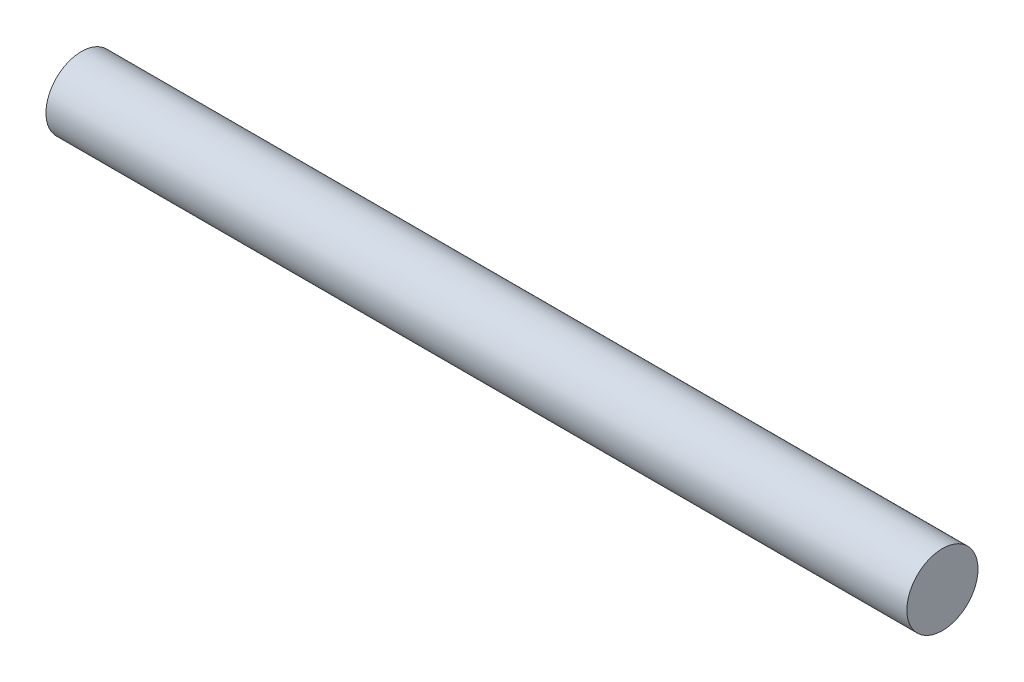
ISO-10303-21;
HEADER;
FILE_DESCRIPTION(('STEP AP214'),'2;1');
FILE_NAME('part.step','',(''),(''),'','','');
FILE_SCHEMA(('AUTOMOTIVE_DESIGN { 1 0 10303 214 1 1 1 1 }'));
ENDSEC;
DATA;
#1=APPLICATION_CONTEXT('core data for automotive mechanical design processes');
#2=APPLICATION_PROTOCOL_DEFINITION('international standard','automotive_design',2000,#1);
#3=PRODUCT_CONTEXT('',#1,'mechanical');
#4=PRODUCT('Part','Part','',(#3));
#5=PRODUCT_RELATED_PRODUCT_CATEGORY('part','',(#4));
#6=PRODUCT_DEFINITION_FORMATION('','',#4);
#7=PRODUCT_DEFINITION_CONTEXT('part definition',#1,'design');
#8=PRODUCT_DEFINITION('design','',#6,#7);
#9=PRODUCT_DEFINITION_SHAPE('','',#8);
#10=(LENGTH_UNIT() NAMED_UNIT(*) SI_UNIT(.MILLI.,.METRE.));
#11=(NAMED_UNIT(*) PLANE_ANGLE_UNIT() SI_UNIT($,.RADIAN.));
#12=(NAMED_UNIT(*) SI_UNIT($,.STERADIAN.) SOLID_ANGLE_UNIT());
#13=UNCERTAINTY_MEASURE_WITH_UNIT(LENGTH_MEASURE(1.E-05),#10,'distance_accuracy_value','');
#14=(GEOMETRIC_REPRESENTATION_CONTEXT(3) GLOBAL_UNCERTAINTY_ASSIGNED_CONTEXT((#13)) GLOBAL_UNIT_ASSIGNED_CONTEXT((#10,
#11,#12)) REPRESENTATION_CONTEXT('',''));
#15=CARTESIAN_POINT('',(0.,0.,0.));
#16=DIRECTION('',(0.,0.,1.));
#17=DIRECTION('',(1.,0.,0.));
#18=AXIS2_PLACEMENT_3D('',#15,#16,#17);
#19=CARTESIAN_POINT('',(72.63,0.,0.));
#20=DIRECTION('',(-1.,0.,0.));
#21=DIRECTION('',(0.,0.,1.));
#22=AXIS2_PLACEMENT_3D('',#19,#20,#21);
#23=CYLINDRICAL_SURFACE('',#22,3.);
#24=CARTESIAN_POINT('',(72.63,0.,0.));
#25=DIRECTION('',(1.,0.,0.));
#26=DIRECTION('',(0.,0.,-1.));
#27=AXIS2_PLACEMENT_3D('',#24,#25,#26);
#28=CIRCLE('',#27,3.);
#29=CARTESIAN_POINT('',(72.63,0.,-3.));
#30=VERTEX_POINT('',#29);
#31=EDGE_CURVE('E10',#30,#30,#28,.T.);
#32=ORIENTED_EDGE('',*,*,#31,.F.);
#33=EDGE_LOOP('',(#32));
#34=FACE_BOUND('',#33,.T.);
#35=CARTESIAN_POINT('',(0.,0.,0.));
#36=DIRECTION('',(1.,0.,0.));
#37=DIRECTION('',(0.,0.,-1.));
#38=AXIS2_PLACEMENT_3D('',#35,#36,#37);
#39=CIRCLE('',#38,3.);
#40=CARTESIAN_POINT('',(0.,0.,-3.));
#41=VERTEX_POINT('',#40);
#42=EDGE_CURVE('E36',#41,#41,#39,.T.);
#43=ORIENTED_EDGE('',*,*,#42,.T.);
#44=EDGE_LOOP('',(#43));
#45=FACE_BOUND('',#44,.T.);
#46=ADVANCED_FACE('F33',(#34,#45),#23,.T.);
#47=CARTESIAN_POINT('',(72.63,0.,0.));
#48=DIRECTION('',(1.,0.,0.));
#49=DIRECTION('',(0.,0.,-1.));
#50=AXIS2_PLACEMENT_3D('',#47,#48,#49);
#51=PLANE('',#50);
#52=ORIENTED_EDGE('',*,*,#31,.T.);
#53=EDGE_LOOP('',(#52));
#54=FACE_BOUND('',#53,.T.);
#55=ADVANCED_FACE('F48',(#54),#51,.T.);
#56=CARTESIAN_POINT('',(0.,0.,0.));
#57=DIRECTION('',(1.,0.,0.));
#58=DIRECTION('',(0.,0.,-1.));
#59=AXIS2_PLACEMENT_3D('',#56,#57,#58);
#60=PLANE('',#59);
#61=ORIENTED_EDGE('',*,*,#42,.F.);
#62=EDGE_LOOP('',(#61));
#63=FACE_BOUND('',#62,.T.);
#64=ADVANCED_FACE('F46',(#63),#60,.F.);
#65=CLOSED_SHELL('',(#46,#55,#64));
#66=MANIFOLD_SOLID_BREP('B2',#65);
#67=ADVANCED_BREP_SHAPE_REPRESENTATION('',(#18,#66),#14);
#68=SHAPE_DEFINITION_REPRESENTATION(#9,#67);
ENDSEC;
END-ISO-10303-21;
